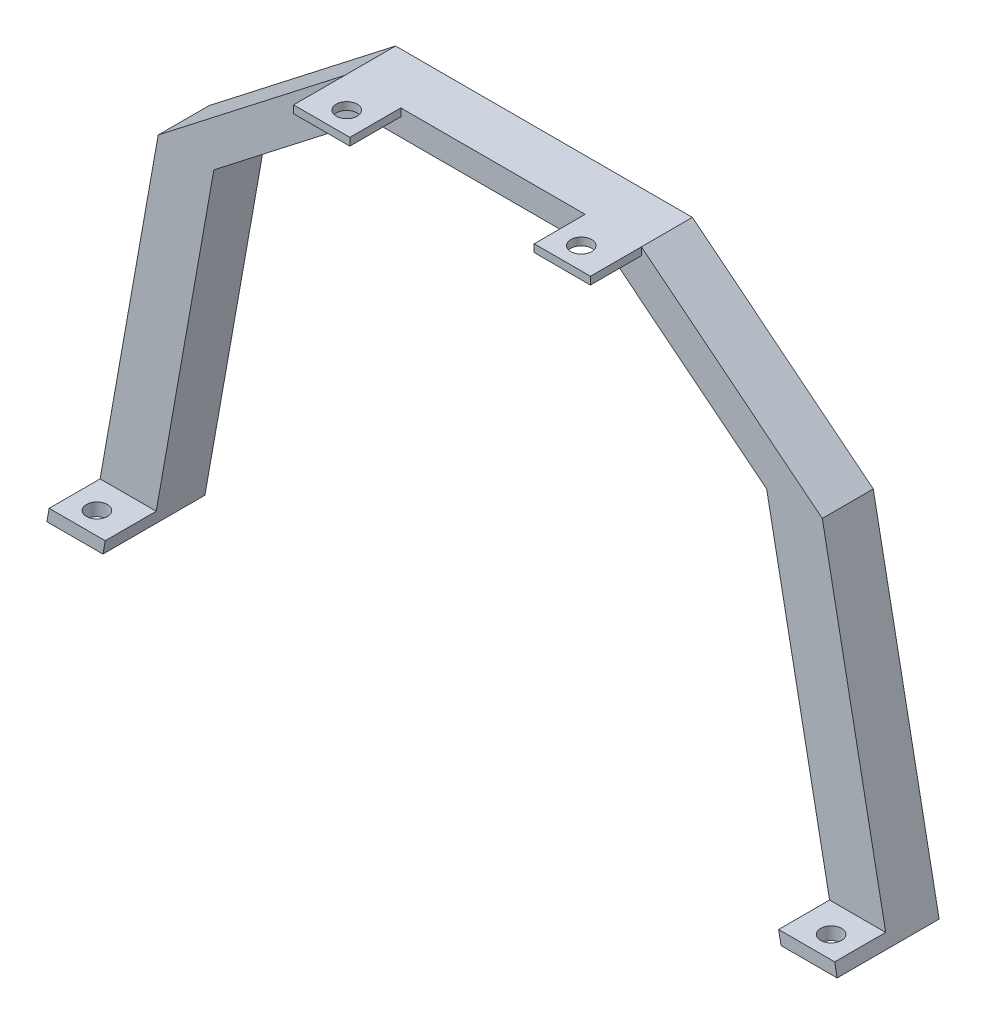
ISO-10303-21;
HEADER;
FILE_DESCRIPTION(('STEP AP214'),'2;1');
FILE_NAME('part.step','',(''),(''),'','','');
FILE_SCHEMA(('AUTOMOTIVE_DESIGN { 1 0 10303 214 1 1 1 1 }'));
ENDSEC;
DATA;
#1=APPLICATION_CONTEXT('core data for automotive mechanical design processes');
#2=APPLICATION_PROTOCOL_DEFINITION('international standard','automotive_design',2000,#1);
#3=PRODUCT_CONTEXT('',#1,'mechanical');
#4=PRODUCT('Part','Part','',(#3));
#5=PRODUCT_RELATED_PRODUCT_CATEGORY('part','',(#4));
#6=PRODUCT_DEFINITION_FORMATION('','',#4);
#7=PRODUCT_DEFINITION_CONTEXT('part definition',#1,'design');
#8=PRODUCT_DEFINITION('design','',#6,#7);
#9=PRODUCT_DEFINITION_SHAPE('','',#8);
#10=(LENGTH_UNIT() NAMED_UNIT(*) SI_UNIT(.MILLI.,.METRE.));
#11=(NAMED_UNIT(*) PLANE_ANGLE_UNIT() SI_UNIT($,.RADIAN.));
#12=(NAMED_UNIT(*) SI_UNIT($,.STERADIAN.) SOLID_ANGLE_UNIT());
#13=UNCERTAINTY_MEASURE_WITH_UNIT(LENGTH_MEASURE(1.E-05),#10,'distance_accuracy_value','');
#14=(GEOMETRIC_REPRESENTATION_CONTEXT(3) GLOBAL_UNCERTAINTY_ASSIGNED_CONTEXT((#13)) GLOBAL_UNIT_ASSIGNED_CONTEXT((#10,
#11,#12)) REPRESENTATION_CONTEXT('',''));
#15=CARTESIAN_POINT('',(0.,0.,0.));
#16=DIRECTION('',(0.,0.,1.));
#17=DIRECTION('',(1.,0.,0.));
#18=AXIS2_PLACEMENT_3D('',#15,#16,#17);
#19=CARTESIAN_POINT('',(37.3909379379324,95.,10.));
#20=DIRECTION('',(0.,-1.,0.));
#21=DIRECTION('',(1.,0.,0.));
#22=AXIS2_PLACEMENT_3D('',#19,#20,#21);
#23=PLANE('',#22);
#24=DIRECTION('',(-1.,0.,0.));
#25=VECTOR('',#24,1.);
#26=CARTESIAN_POINT('',(37.3909379379324,95.,0.));
#27=LINE('',#26,#25);
#28=CARTESIAN_POINT('',(95.6090620620676,95.,0.));
#29=VERTEX_POINT('',#28);
#30=CARTESIAN_POINT('',(37.3909379379324,95.,0.));
#31=VERTEX_POINT('',#30);
#32=EDGE_CURVE('E343',#29,#31,#27,.T.);
#33=ORIENTED_EDGE('',*,*,#32,.T.);
#34=DIRECTION('',(0.,0.,-1.));
#35=VECTOR('',#34,1.);
#36=CARTESIAN_POINT('',(37.3909379379324,95.,10.));
#37=LINE('',#36,#35);
#38=CARTESIAN_POINT('',(37.3909379379324,95.,10.));
#39=VERTEX_POINT('',#38);
#40=EDGE_CURVE('E358',#39,#31,#37,.T.);
#41=ORIENTED_EDGE('',*,*,#40,.F.);
#42=DIRECTION('',(0.,0.,-1.));
#43=VECTOR('',#42,1.);
#44=CARTESIAN_POINT('',(37.3909379379324,95.,20.));
#45=LINE('',#44,#43);
#46=CARTESIAN_POINT('',(37.3909379379324,95.,20.));
#47=VERTEX_POINT('',#46);
#48=EDGE_CURVE('E242',#47,#39,#45,.T.);
#49=ORIENTED_EDGE('',*,*,#48,.F.);
#50=DIRECTION('',(1.,0.,0.));
#51=VECTOR('',#50,1.);
#52=CARTESIAN_POINT('',(37.3909379379324,95.,20.));
#53=LINE('',#52,#51);
#54=CARTESIAN_POINT('',(48.4211280956552,95.,20.));
#55=VERTEX_POINT('',#54);
#56=EDGE_CURVE('E240',#47,#55,#53,.T.);
#57=ORIENTED_EDGE('',*,*,#56,.T.);
#58=DIRECTION('',(0.,0.,-1.));
#59=VECTOR('',#58,1.);
#60=CARTESIAN_POINT('',(48.4211280956552,95.,20.));
#61=LINE('',#60,#59);
#62=CARTESIAN_POINT('',(48.4211280956552,95.,10.));
#63=VERTEX_POINT('',#62);
#64=EDGE_CURVE('E197',#55,#63,#61,.T.);
#65=ORIENTED_EDGE('',*,*,#64,.T.);
#66=DIRECTION('',(-1.,0.,0.));
#67=VECTOR('',#66,1.);
#68=CARTESIAN_POINT('',(37.3909379379324,95.,10.));
#69=LINE('',#68,#67);
#70=CARTESIAN_POINT('',(84.5788719043448,95.,10.));
#71=VERTEX_POINT('',#70);
#72=EDGE_CURVE('E190',#71,#63,#69,.T.);
#73=ORIENTED_EDGE('',*,*,#72,.F.);
#74=DIRECTION('',(0.,0.,-1.));
#75=VECTOR('',#74,1.);
#76=CARTESIAN_POINT('',(84.5788719043448,95.,20.));
#77=LINE('',#76,#75);
#78=CARTESIAN_POINT('',(84.5788719043448,95.,20.));
#79=VERTEX_POINT('',#78);
#80=EDGE_CURVE('E194',#79,#71,#77,.T.);
#81=ORIENTED_EDGE('',*,*,#80,.F.);
#82=DIRECTION('',(-1.,0.,0.));
#83=VECTOR('',#82,1.);
#84=CARTESIAN_POINT('',(95.6090620620676,95.,20.));
#85=LINE('',#84,#83);
#86=CARTESIAN_POINT('',(95.6090620620676,95.,20.));
#87=VERTEX_POINT('',#86);
#88=EDGE_CURVE('E223',#87,#79,#85,.T.);
#89=ORIENTED_EDGE('',*,*,#88,.F.);
#90=DIRECTION('',(0.,0.,-1.));
#91=VECTOR('',#90,1.);
#92=CARTESIAN_POINT('',(95.6090620620676,95.,20.));
#93=LINE('',#92,#91);
#94=CARTESIAN_POINT('',(95.6090620620676,95.,10.));
#95=VERTEX_POINT('',#94);
#96=EDGE_CURVE('E212',#87,#95,#93,.T.);
#97=ORIENTED_EDGE('',*,*,#96,.T.);
#98=DIRECTION('',(0.,0.,-1.));
#99=VECTOR('',#98,1.);
#100=CARTESIAN_POINT('',(95.6090620620676,95.,10.));
#101=LINE('',#100,#99);
#102=EDGE_CURVE('E361',#95,#29,#101,.T.);
#103=ORIENTED_EDGE('',*,*,#102,.T.);
#104=EDGE_LOOP('',(#33,#41,#49,#57,#65,#73,#81,#89,#97,#103));
#105=FACE_BOUND('',#104,.T.);
#106=CARTESIAN_POINT('',(89.5,95.,15.6873727087576));
#107=DIRECTION('',(0.,1.,0.));
#108=DIRECTION('',(0.,0.,1.));
#109=AXIS2_PLACEMENT_3D('',#106,#107,#108);
#110=CIRCLE('',#109,2.04999999999999);
#111=CARTESIAN_POINT('',(89.5,95.,17.7373727087576));
#112=VERTEX_POINT('',#111);
#113=EDGE_CURVE('E387',#112,#112,#110,.F.);
#114=ORIENTED_EDGE('',*,*,#113,.T.);
#115=EDGE_LOOP('',(#114));
#116=FACE_BOUND('',#115,.T.);
#117=CARTESIAN_POINT('',(43.5,95.,15.6873727087576));
#118=DIRECTION('',(0.,1.,0.));
#119=DIRECTION('',(0.,0.,1.));
#120=AXIS2_PLACEMENT_3D('',#117,#118,#119);
#121=CIRCLE('',#120,2.05);
#122=CARTESIAN_POINT('',(43.5,95.,17.7373727087576));
#123=VERTEX_POINT('',#122);
#124=EDGE_CURVE('E382',#123,#123,#121,.T.);
#125=ORIENTED_EDGE('',*,*,#124,.F.);
#126=EDGE_LOOP('',(#125));
#127=FACE_BOUND('',#126,.T.);
#128=ADVANCED_FACE('F33',(#105,#116,#127),#23,.F.);
#129=CARTESIAN_POINT('',(0.,0.,10.));
#130=DIRECTION('',(0.,0.,-1.));
#131=DIRECTION('',(-1.,0.,0.));
#132=AXIS2_PLACEMENT_3D('',#129,#130,#131);
#133=PLANE('',#132);
#134=DIRECTION('',(-0.780710815786578,0.624892488444097,0.));
#135=VECTOR('',#134,1.);
#136=CARTESIAN_POINT('',(95.6090620620676,95.,10.));
#137=LINE('',#136,#135);
#138=CARTESIAN_POINT('',(131.084052408404,66.6052928346872,10.));
#139=VERTEX_POINT('',#138);
#140=EDGE_CURVE('E200',#139,#95,#137,.T.);
#141=ORIENTED_EDGE('',*,*,#140,.T.);
#142=DIRECTION('',(0.,-1.,0.));
#143=VECTOR('',#142,1.);
#144=CARTESIAN_POINT('',(95.6090620620676,95.,10.));
#145=LINE('',#144,#143);
#146=CARTESIAN_POINT('',(95.6090620620676,93.5,10.));
#147=VERTEX_POINT('',#146);
#148=EDGE_CURVE('E55',#95,#147,#145,.T.);
#149=ORIENTED_EDGE('',*,*,#148,.T.);
#150=DIRECTION('',(-1.,0.,0.));
#151=VECTOR('',#150,1.);
#152=CARTESIAN_POINT('',(95.6090620620676,93.5,10.));
#153=LINE('',#152,#151);
#154=CARTESIAN_POINT('',(84.5788719043448,93.5,10.));
#155=VERTEX_POINT('',#154);
#156=EDGE_CURVE('E50',#147,#155,#153,.T.);
#157=ORIENTED_EDGE('',*,*,#156,.T.);
#158=DIRECTION('',(0.,-1.,0.));
#159=VECTOR('',#158,1.);
#160=CARTESIAN_POINT('',(84.5788719043448,95.,10.));
#161=LINE('',#160,#159);
#162=EDGE_CURVE('E203',#71,#155,#161,.T.);
#163=ORIENTED_EDGE('',*,*,#162,.F.);
#164=ORIENTED_EDGE('',*,*,#72,.T.);
#165=DIRECTION('',(0.,-1.,0.));
#166=VECTOR('',#165,1.);
#167=CARTESIAN_POINT('',(48.4211280956552,95.,10.));
#168=LINE('',#167,#166);
#169=CARTESIAN_POINT('',(48.4211280956552,93.5,10.));
#170=VERTEX_POINT('',#169);
#171=EDGE_CURVE('E235',#63,#170,#168,.T.);
#172=ORIENTED_EDGE('',*,*,#171,.T.);
#173=DIRECTION('',(1.,0.,0.));
#174=VECTOR('',#173,1.);
#175=CARTESIAN_POINT('',(37.3909379379324,93.5,10.));
#176=LINE('',#175,#174);
#177=CARTESIAN_POINT('',(37.3909379379324,93.5,10.));
#178=VERTEX_POINT('',#177);
#179=EDGE_CURVE('E245',#178,#170,#176,.T.);
#180=ORIENTED_EDGE('',*,*,#179,.F.);
#181=DIRECTION('',(0.,-1.,0.));
#182=VECTOR('',#181,1.);
#183=CARTESIAN_POINT('',(37.3909379379324,95.,10.));
#184=LINE('',#183,#182);
#185=EDGE_CURVE('E222',#39,#178,#184,.T.);
#186=ORIENTED_EDGE('',*,*,#185,.F.);
#187=DIRECTION('',(-0.789791008388379,-0.613376037247028,0.));
#188=VECTOR('',#187,1.);
#189=CARTESIAN_POINT('',(0.829541595098959,66.6052928346872,10.));
#190=LINE('',#189,#188);
#191=CARTESIAN_POINT('',(0.829541595098959,66.6052928346872,10.));
#192=VERTEX_POINT('',#191);
#193=EDGE_CURVE('E199',#39,#192,#190,.T.);
#194=ORIENTED_EDGE('',*,*,#193,.T.);
#195=DIRECTION('',(-0.174869984182596,-0.984591533902247,0.));
#196=VECTOR('',#195,1.);
#197=CARTESIAN_POINT('',(-11.,0.,10.));
#198=LINE('',#197,#196);
#199=CARTESIAN_POINT('',(-10.5559834252039,2.5,10.));
#200=VERTEX_POINT('',#199);
#201=EDGE_CURVE('E324',#192,#200,#198,.T.);
#202=ORIENTED_EDGE('',*,*,#201,.T.);
#203=DIRECTION('',(-1.,0.,0.));
#204=VECTOR('',#203,1.);
#205=CARTESIAN_POINT('',(0.444016574796075,2.5,10.));
#206=LINE('',#205,#204);
#207=CARTESIAN_POINT('',(0.444016574796076,2.5,10.));
#208=VERTEX_POINT('',#207);
#209=EDGE_CURVE('E289',#208,#200,#206,.T.);
#210=ORIENTED_EDGE('',*,*,#209,.F.);
#211=DIRECTION('',(0.174869984182596,0.984591533902247,0.));
#212=VECTOR('',#211,1.);
#213=CARTESIAN_POINT('',(0.,0.,10.));
#214=LINE('',#213,#212);
#215=CARTESIAN_POINT('',(11.7453685319245,66.131363098995,10.));
#216=VERTEX_POINT('',#215);
#217=EDGE_CURVE('E309',#208,#216,#214,.T.);
#218=ORIENTED_EDGE('',*,*,#217,.T.);
#219=DIRECTION('',(0.789791008388379,0.613376037247028,0.));
#220=VECTOR('',#219,1.);
#221=CARTESIAN_POINT('',(11.7453685319245,66.131363098995,10.));
#222=LINE('',#221,#220);
#223=CARTESIAN_POINT('',(42.4789376023914,90.,10.));
#224=VERTEX_POINT('',#223);
#225=EDGE_CURVE('E311',#216,#224,#222,.T.);
#226=ORIENTED_EDGE('',*,*,#225,.T.);
#227=DIRECTION('',(1.,0.,0.));
#228=VECTOR('',#227,1.);
#229=CARTESIAN_POINT('',(42.4789376023914,90.,10.));
#230=LINE('',#229,#228);
#231=CARTESIAN_POINT('',(90.3556213621701,90.,10.));
#232=VERTEX_POINT('',#231);
#233=EDGE_CURVE('E314',#224,#232,#230,.T.);
#234=ORIENTED_EDGE('',*,*,#233,.T.);
#235=DIRECTION('',(0.780710815786578,-0.624892488444098,0.));
#236=VECTOR('',#235,1.);
#237=CARTESIAN_POINT('',(90.3556213621701,90.,10.));
#238=LINE('',#237,#236);
#239=CARTESIAN_POINT('',(120.175955789769,66.1313630989951,10.));
#240=VERTEX_POINT('',#239);
#241=EDGE_CURVE('E316',#232,#240,#238,.T.);
#242=ORIENTED_EDGE('',*,*,#241,.T.);
#243=DIRECTION('',(0.190371396148273,-0.981712142905728,0.));
#244=VECTOR('',#243,1.);
#245=CARTESIAN_POINT('',(120.175955789769,66.1313630989951,10.));
#246=LINE('',#245,#244);
#247=CARTESIAN_POINT('',(132.51520566002,2.50000000000002,10.));
#248=VERTEX_POINT('',#247);
#249=EDGE_CURVE('E318',#240,#248,#246,.T.);
#250=ORIENTED_EDGE('',*,*,#249,.T.);
#251=DIRECTION('',(-1.,0.,0.));
#252=VECTOR('',#251,1.);
#253=CARTESIAN_POINT('',(143.51520566002,2.5,10.));
#254=LINE('',#253,#252);
#255=CARTESIAN_POINT('',(143.51520566002,2.5,10.));
#256=VERTEX_POINT('',#255);
#257=EDGE_CURVE('E270',#256,#248,#254,.T.);
#258=ORIENTED_EDGE('',*,*,#257,.F.);
#259=DIRECTION('',(-0.190371396148273,0.981712142905728,0.));
#260=VECTOR('',#259,1.);
#261=CARTESIAN_POINT('',(131.084052408404,66.6052928346872,10.));
#262=LINE('',#261,#260);
#263=EDGE_CURVE('E320',#256,#139,#262,.T.);
#264=ORIENTED_EDGE('',*,*,#263,.T.);
#265=EDGE_LOOP('',(#141,#149,#157,#163,#164,#172,#180,#186,#194,#202,#210,#218,#226,#234,#242,
#250,#258,#264));
#266=FACE_BOUND('',#265,.T.);
#267=ADVANCED_FACE('F204',(#266),#133,.F.);
#268=CARTESIAN_POINT('',(0.,0.,10.));
#269=DIRECTION('',(-0.984591533902247,0.174869984182596,0.));
#270=DIRECTION('',(-0.174869984182596,-0.984591533902247,0.));
#271=AXIS2_PLACEMENT_3D('',#268,#269,#270);
#272=PLANE('',#271);
#273=DIRECTION('',(0.174869984182596,0.984591533902247,0.));
#274=VECTOR('',#273,1.);
#275=CARTESIAN_POINT('',(0.,0.,0.));
#276=LINE('',#275,#274);
#277=CARTESIAN_POINT('',(0.,0.,0.));
#278=VERTEX_POINT('',#277);
#279=CARTESIAN_POINT('',(11.7453685319245,66.131363098995,0.));
#280=VERTEX_POINT('',#279);
#281=EDGE_CURVE('E308',#278,#280,#276,.T.);
#282=ORIENTED_EDGE('',*,*,#281,.T.);
#283=DIRECTION('',(0.,0.,-1.));
#284=VECTOR('',#283,1.);
#285=CARTESIAN_POINT('',(11.7453685319245,66.131363098995,10.));
#286=LINE('',#285,#284);
#287=EDGE_CURVE('E11',#216,#280,#286,.T.);
#288=ORIENTED_EDGE('',*,*,#287,.F.);
#289=ORIENTED_EDGE('',*,*,#217,.F.);
#290=DIRECTION('',(0.,0.,-1.));
#291=VECTOR('',#290,1.);
#292=CARTESIAN_POINT('',(0.444016574796075,2.5,20.));
#293=LINE('',#292,#291);
#294=CARTESIAN_POINT('',(0.444016574796075,2.5,20.));
#295=VERTEX_POINT('',#294);
#296=EDGE_CURVE('E305',#295,#208,#293,.T.);
#297=ORIENTED_EDGE('',*,*,#296,.F.);
#298=DIRECTION('',(0.174869984182596,0.984591533902247,0.));
#299=VECTOR('',#298,1.);
#300=CARTESIAN_POINT('',(0.,0.,20.));
#301=LINE('',#300,#299);
#302=CARTESIAN_POINT('',(0.,0.,20.));
#303=VERTEX_POINT('',#302);
#304=EDGE_CURVE('E296',#303,#295,#301,.T.);
#305=ORIENTED_EDGE('',*,*,#304,.F.);
#306=DIRECTION('',(0.,0.,-1.));
#307=VECTOR('',#306,1.);
#308=CARTESIAN_POINT('',(0.,0.,10.));
#309=LINE('',#308,#307);
#310=EDGE_CURVE('E326',#303,#278,#309,.T.);
#311=ORIENTED_EDGE('',*,*,#310,.T.);
#312=EDGE_LOOP('',(#282,#288,#289,#297,#305,#311));
#313=FACE_BOUND('',#312,.T.);
#314=ADVANCED_FACE('F35',(#313),#272,.F.);
#315=CARTESIAN_POINT('',(11.7453685319245,66.131363098995,10.));
#316=DIRECTION('',(-0.613376037247028,0.789791008388379,0.));
#317=DIRECTION('',(-0.789791008388379,-0.613376037247028,0.));
#318=AXIS2_PLACEMENT_3D('',#315,#316,#317);
#319=PLANE('',#318);
#320=DIRECTION('',(0.789791008388379,0.613376037247028,0.));
#321=VECTOR('',#320,1.);
#322=CARTESIAN_POINT('',(11.7453685319245,66.131363098995,0.));
#323=LINE('',#322,#321);
#324=CARTESIAN_POINT('',(42.4789376023914,90.,0.));
#325=VERTEX_POINT('',#324);
#326=EDGE_CURVE('E329',#280,#325,#323,.T.);
#327=ORIENTED_EDGE('',*,*,#326,.T.);
#328=DIRECTION('',(0.,0.,-1.));
#329=VECTOR('',#328,1.);
#330=CARTESIAN_POINT('',(42.4789376023914,90.,10.));
#331=LINE('',#330,#329);
#332=EDGE_CURVE('E42',#224,#325,#331,.T.);
#333=ORIENTED_EDGE('',*,*,#332,.F.);
#334=ORIENTED_EDGE('',*,*,#225,.F.);
#335=ORIENTED_EDGE('',*,*,#287,.T.);
#336=EDGE_LOOP('',(#327,#333,#334,#335));
#337=FACE_BOUND('',#336,.T.);
#338=ADVANCED_FACE('F434',(#337),#319,.F.);
#339=CARTESIAN_POINT('',(42.4789376023914,90.,10.));
#340=DIRECTION('',(0.,1.,0.));
#341=DIRECTION('',(-1.,0.,0.));
#342=AXIS2_PLACEMENT_3D('',#339,#340,#341);
#343=PLANE('',#342);
#344=DIRECTION('',(1.,0.,0.));
#345=VECTOR('',#344,1.);
#346=CARTESIAN_POINT('',(42.4789376023914,90.,0.));
#347=LINE('',#346,#345);
#348=CARTESIAN_POINT('',(90.3556213621701,90.,0.));
#349=VERTEX_POINT('',#348);
#350=EDGE_CURVE('E331',#325,#349,#347,.T.);
#351=ORIENTED_EDGE('',*,*,#350,.T.);
#352=DIRECTION('',(0.,0.,-1.));
#353=VECTOR('',#352,1.);
#354=CARTESIAN_POINT('',(90.3556213621701,90.,10.));
#355=LINE('',#354,#353);
#356=EDGE_CURVE('E376',#232,#349,#355,.T.);
#357=ORIENTED_EDGE('',*,*,#356,.F.);
#358=ORIENTED_EDGE('',*,*,#233,.F.);
#359=ORIENTED_EDGE('',*,*,#332,.T.);
#360=EDGE_LOOP('',(#351,#357,#358,#359));
#361=FACE_BOUND('',#360,.T.);
#362=ADVANCED_FACE('F439',(#361),#343,.F.);
#363=CARTESIAN_POINT('',(90.3556213621701,90.,10.));
#364=DIRECTION('',(0.624892488444098,0.780710815786578,0.));
#365=DIRECTION('',(-0.780710815786578,0.624892488444098,0.));
#366=AXIS2_PLACEMENT_3D('',#363,#364,#365);
#367=PLANE('',#366);
#368=DIRECTION('',(0.780710815786578,-0.624892488444098,0.));
#369=VECTOR('',#368,1.);
#370=CARTESIAN_POINT('',(90.3556213621701,90.,0.));
#371=LINE('',#370,#369);
#372=CARTESIAN_POINT('',(120.175955789769,66.1313630989951,0.));
#373=VERTEX_POINT('',#372);
#374=EDGE_CURVE('E333',#349,#373,#371,.T.);
#375=ORIENTED_EDGE('',*,*,#374,.T.);
#376=DIRECTION('',(0.,0.,-1.));
#377=VECTOR('',#376,1.);
#378=CARTESIAN_POINT('',(120.175955789769,66.1313630989951,10.));
#379=LINE('',#378,#377);
#380=EDGE_CURVE('E373',#240,#373,#379,.T.);
#381=ORIENTED_EDGE('',*,*,#380,.F.);
#382=ORIENTED_EDGE('',*,*,#241,.F.);
#383=ORIENTED_EDGE('',*,*,#356,.T.);
#384=EDGE_LOOP('',(#375,#381,#382,#383));
#385=FACE_BOUND('',#384,.T.);
#386=ADVANCED_FACE('F445',(#385),#367,.F.);
#387=CARTESIAN_POINT('',(120.175955789769,66.1313630989951,10.));
#388=DIRECTION('',(0.981712142905728,0.190371396148273,0.));
#389=DIRECTION('',(-0.190371396148273,0.981712142905728,0.));
#390=AXIS2_PLACEMENT_3D('',#387,#388,#389);
#391=PLANE('',#390);
#392=DIRECTION('',(0.190371396148273,-0.981712142905728,0.));
#393=VECTOR('',#392,1.);
#394=CARTESIAN_POINT('',(120.175955789769,66.1313630989951,0.));
#395=LINE('',#394,#393);
#396=CARTESIAN_POINT('',(133.,0.,0.));
#397=VERTEX_POINT('',#396);
#398=EDGE_CURVE('E335',#373,#397,#395,.T.);
#399=ORIENTED_EDGE('',*,*,#398,.T.);
#400=DIRECTION('',(0.,0.,-1.));
#401=VECTOR('',#400,1.);
#402=CARTESIAN_POINT('',(133.,0.,10.));
#403=LINE('',#402,#401);
#404=CARTESIAN_POINT('',(133.,0.,20.));
#405=VERTEX_POINT('',#404);
#406=EDGE_CURVE('E370',#405,#397,#403,.T.);
#407=ORIENTED_EDGE('',*,*,#406,.F.);
#408=DIRECTION('',(0.190371396148276,-0.981712142905728,0.));
#409=VECTOR('',#408,1.);
#410=CARTESIAN_POINT('',(132.51520566002,2.5,20.));
#411=LINE('',#410,#409);
#412=CARTESIAN_POINT('',(132.51520566002,2.5,20.));
#413=VERTEX_POINT('',#412);
#414=EDGE_CURVE('E271',#413,#405,#411,.T.);
#415=ORIENTED_EDGE('',*,*,#414,.F.);
#416=DIRECTION('',(0.,0.,-1.));
#417=VECTOR('',#416,1.);
#418=CARTESIAN_POINT('',(132.51520566002,2.5,20.));
#419=LINE('',#418,#417);
#420=EDGE_CURVE('E281',#413,#248,#419,.T.);
#421=ORIENTED_EDGE('',*,*,#420,.T.);
#422=ORIENTED_EDGE('',*,*,#249,.F.);
#423=ORIENTED_EDGE('',*,*,#380,.T.);
#424=EDGE_LOOP('',(#399,#407,#415,#421,#422,#423));
#425=FACE_BOUND('',#424,.T.);
#426=ADVANCED_FACE('F449',(#425),#391,.F.);
#427=CARTESIAN_POINT('',(133.,0.,10.));
#428=DIRECTION('',(0.,1.,0.));
#429=DIRECTION('',(0.,0.,1.));
#430=AXIS2_PLACEMENT_3D('',#427,#428,#429);
#431=PLANE('',#430);
#432=CARTESIAN_POINT('',(138.5,0.,15.6873727087576));
#433=DIRECTION('',(0.,1.,0.));
#434=DIRECTION('',(0.,0.,1.));
#435=AXIS2_PLACEMENT_3D('',#432,#433,#434);
#436=CIRCLE('',#435,2.04999999999999);
#437=CARTESIAN_POINT('',(138.5,0.,17.7373727087576));
#438=VERTEX_POINT('',#437);
#439=EDGE_CURVE('E262',#438,#438,#436,.T.);
#440=ORIENTED_EDGE('',*,*,#439,.T.);
#441=EDGE_LOOP('',(#440));
#442=FACE_BOUND('',#441,.T.);
#443=DIRECTION('',(1.,0.,0.));
#444=VECTOR('',#443,1.);
#445=CARTESIAN_POINT('',(133.,0.,0.));
#446=LINE('',#445,#444);
#447=CARTESIAN_POINT('',(144.,0.,0.));
#448=VERTEX_POINT('',#447);
#449=EDGE_CURVE('E337',#397,#448,#446,.T.);
#450=ORIENTED_EDGE('',*,*,#449,.T.);
#451=DIRECTION('',(0.,0.,-1.));
#452=VECTOR('',#451,1.);
#453=CARTESIAN_POINT('',(144.,0.,10.));
#454=LINE('',#453,#452);
#455=CARTESIAN_POINT('',(144.,0.,20.));
#456=VERTEX_POINT('',#455);
#457=EDGE_CURVE('E367',#456,#448,#454,.T.);
#458=ORIENTED_EDGE('',*,*,#457,.F.);
#459=DIRECTION('',(1.,0.,0.));
#460=VECTOR('',#459,1.);
#461=CARTESIAN_POINT('',(133.,0.,20.));
#462=LINE('',#461,#460);
#463=EDGE_CURVE('E274',#405,#456,#462,.T.);
#464=ORIENTED_EDGE('',*,*,#463,.F.);
#465=ORIENTED_EDGE('',*,*,#406,.T.);
#466=EDGE_LOOP('',(#450,#458,#464,#465));
#467=FACE_BOUND('',#466,.T.);
#468=ADVANCED_FACE('F467',(#442,#467),#431,.F.);
#469=CARTESIAN_POINT('',(131.084052408404,66.6052928346872,10.));
#470=DIRECTION('',(-0.981712142905728,-0.190371396148273,0.));
#471=DIRECTION('',(0.190371396148273,-0.981712142905728,0.));
#472=AXIS2_PLACEMENT_3D('',#469,#470,#471);
#473=PLANE('',#472);
#474=DIRECTION('',(-0.190371396148273,0.981712142905728,0.));
#475=VECTOR('',#474,1.);
#476=CARTESIAN_POINT('',(131.084052408404,66.6052928346872,0.));
#477=LINE('',#476,#475);
#478=CARTESIAN_POINT('',(131.084052408404,66.6052928346872,0.));
#479=VERTEX_POINT('',#478);
#480=EDGE_CURVE('E339',#448,#479,#477,.T.);
#481=ORIENTED_EDGE('',*,*,#480,.T.);
#482=DIRECTION('',(0.,0.,-1.));
#483=VECTOR('',#482,1.);
#484=CARTESIAN_POINT('',(131.084052408404,66.6052928346872,10.));
#485=LINE('',#484,#483);
#486=EDGE_CURVE('E364',#139,#479,#485,.T.);
#487=ORIENTED_EDGE('',*,*,#486,.F.);
#488=ORIENTED_EDGE('',*,*,#263,.F.);
#489=DIRECTION('',(0.,0.,-1.));
#490=VECTOR('',#489,1.);
#491=CARTESIAN_POINT('',(143.51520566002,2.5,20.));
#492=LINE('',#491,#490);
#493=CARTESIAN_POINT('',(143.51520566002,2.5,20.));
#494=VERTEX_POINT('',#493);
#495=EDGE_CURVE('E286',#494,#256,#492,.T.);
#496=ORIENTED_EDGE('',*,*,#495,.F.);
#497=DIRECTION('',(-0.190371396148276,0.981712142905728,0.));
#498=VECTOR('',#497,1.);
#499=CARTESIAN_POINT('',(144.,0.,20.));
#500=LINE('',#499,#498);
#501=EDGE_CURVE('E277',#456,#494,#500,.T.);
#502=ORIENTED_EDGE('',*,*,#501,.F.);
#503=ORIENTED_EDGE('',*,*,#457,.T.);
#504=EDGE_LOOP('',(#481,#487,#488,#496,#502,#503));
#505=FACE_BOUND('',#504,.T.);
#506=ADVANCED_FACE('F458',(#505),#473,.F.);
#507=CARTESIAN_POINT('',(95.6090620620676,95.,10.));
#508=DIRECTION('',(-0.624892488444097,-0.780710815786578,0.));
#509=DIRECTION('',(0.780710815786578,-0.624892488444097,0.));
#510=AXIS2_PLACEMENT_3D('',#507,#508,#509);
#511=PLANE('',#510);
#512=DIRECTION('',(-0.780710815786578,0.624892488444097,0.));
#513=VECTOR('',#512,1.);
#514=CARTESIAN_POINT('',(95.6090620620676,95.,0.));
#515=LINE('',#514,#513);
#516=EDGE_CURVE('E341',#479,#29,#515,.T.);
#517=ORIENTED_EDGE('',*,*,#516,.T.);
#518=ORIENTED_EDGE('',*,*,#102,.F.);
#519=ORIENTED_EDGE('',*,*,#140,.F.);
#520=ORIENTED_EDGE('',*,*,#486,.T.);
#521=EDGE_LOOP('',(#517,#518,#519,#520));
#522=FACE_BOUND('',#521,.T.);
#523=ADVANCED_FACE('F459',(#522),#511,.F.);
#524=CARTESIAN_POINT('',(0.829541595098959,66.6052928346872,10.));
#525=DIRECTION('',(0.613376037247028,-0.789791008388379,0.));
#526=DIRECTION('',(0.789791008388379,0.613376037247028,0.));
#527=AXIS2_PLACEMENT_3D('',#524,#525,#526);
#528=PLANE('',#527);
#529=DIRECTION('',(-0.789791008388379,-0.613376037247028,0.));
#530=VECTOR('',#529,1.);
#531=CARTESIAN_POINT('',(0.829541595098959,66.6052928346872,0.));
#532=LINE('',#531,#530);
#533=CARTESIAN_POINT('',(0.829541595098959,66.6052928346872,0.));
#534=VERTEX_POINT('',#533);
#535=EDGE_CURVE('E345',#31,#534,#532,.T.);
#536=ORIENTED_EDGE('',*,*,#535,.T.);
#537=DIRECTION('',(0.,0.,-1.));
#538=VECTOR('',#537,1.);
#539=CARTESIAN_POINT('',(0.829541595098959,66.6052928346872,10.));
#540=LINE('',#539,#538);
#541=EDGE_CURVE('E355',#192,#534,#540,.T.);
#542=ORIENTED_EDGE('',*,*,#541,.F.);
#543=ORIENTED_EDGE('',*,*,#193,.F.);
#544=ORIENTED_EDGE('',*,*,#40,.T.);
#545=EDGE_LOOP('',(#536,#542,#543,#544));
#546=FACE_BOUND('',#545,.T.);
#547=ADVANCED_FACE('F416',(#546),#528,.F.);
#548=CARTESIAN_POINT('',(-11.,0.,10.));
#549=DIRECTION('',(0.984591533902246,-0.174869984182596,0.));
#550=DIRECTION('',(0.174869984182596,0.984591533902247,0.));
#551=AXIS2_PLACEMENT_3D('',#548,#549,#550);
#552=PLANE('',#551);
#553=DIRECTION('',(-0.174869984182596,-0.984591533902247,0.));
#554=VECTOR('',#553,1.);
#555=CARTESIAN_POINT('',(-11.,0.,0.));
#556=LINE('',#555,#554);
#557=CARTESIAN_POINT('',(-11.,0.,0.));
#558=VERTEX_POINT('',#557);
#559=EDGE_CURVE('E347',#534,#558,#556,.T.);
#560=ORIENTED_EDGE('',*,*,#559,.T.);
#561=DIRECTION('',(0.,0.,-1.));
#562=VECTOR('',#561,1.);
#563=CARTESIAN_POINT('',(-11.,0.,10.));
#564=LINE('',#563,#562);
#565=CARTESIAN_POINT('',(-11.,0.,20.));
#566=VERTEX_POINT('',#565);
#567=EDGE_CURVE('E352',#566,#558,#564,.T.);
#568=ORIENTED_EDGE('',*,*,#567,.F.);
#569=DIRECTION('',(-0.174869984182596,-0.984591533902247,0.));
#570=VECTOR('',#569,1.);
#571=CARTESIAN_POINT('',(-10.5559834252039,2.5,20.));
#572=LINE('',#571,#570);
#573=CARTESIAN_POINT('',(-10.5559834252039,2.5,20.));
#574=VERTEX_POINT('',#573);
#575=EDGE_CURVE('E290',#574,#566,#572,.T.);
#576=ORIENTED_EDGE('',*,*,#575,.F.);
#577=DIRECTION('',(0.,0.,-1.));
#578=VECTOR('',#577,1.);
#579=CARTESIAN_POINT('',(-10.5559834252039,2.5,20.));
#580=LINE('',#579,#578);
#581=EDGE_CURVE('E300',#574,#200,#580,.T.);
#582=ORIENTED_EDGE('',*,*,#581,.T.);
#583=ORIENTED_EDGE('',*,*,#201,.F.);
#584=ORIENTED_EDGE('',*,*,#541,.T.);
#585=EDGE_LOOP('',(#560,#568,#576,#582,#583,#584));
#586=FACE_BOUND('',#585,.T.);
#587=ADVANCED_FACE('F419',(#586),#552,.F.);
#588=CARTESIAN_POINT('',(0.,0.,10.));
#589=DIRECTION('',(0.,1.,0.));
#590=DIRECTION('',(-1.,0.,0.));
#591=AXIS2_PLACEMENT_3D('',#588,#589,#590);
#592=PLANE('',#591);
#593=CARTESIAN_POINT('',(-5.5,0.,15.6873727087576));
#594=DIRECTION('',(0.,1.,0.));
#595=DIRECTION('',(-1.,0.,0.));
#596=AXIS2_PLACEMENT_3D('',#593,#594,#595);
#597=CIRCLE('',#596,2.05);
#598=CARTESIAN_POINT('',(-7.55,0.,15.6873727087576));
#599=VERTEX_POINT('',#598);
#600=EDGE_CURVE('E267',#599,#599,#597,.T.);
#601=ORIENTED_EDGE('',*,*,#600,.T.);
#602=EDGE_LOOP('',(#601));
#603=FACE_BOUND('',#602,.T.);
#604=DIRECTION('',(1.,0.,0.));
#605=VECTOR('',#604,1.);
#606=CARTESIAN_POINT('',(0.,0.,0.));
#607=LINE('',#606,#605);
#608=EDGE_CURVE('E312',#558,#278,#607,.T.);
#609=ORIENTED_EDGE('',*,*,#608,.T.);
#610=ORIENTED_EDGE('',*,*,#310,.F.);
#611=DIRECTION('',(1.,0.,0.));
#612=VECTOR('',#611,1.);
#613=CARTESIAN_POINT('',(-11.,0.,20.));
#614=LINE('',#613,#612);
#615=EDGE_CURVE('E293',#566,#303,#614,.T.);
#616=ORIENTED_EDGE('',*,*,#615,.F.);
#617=ORIENTED_EDGE('',*,*,#567,.T.);
#618=EDGE_LOOP('',(#609,#610,#616,#617));
#619=FACE_BOUND('',#618,.T.);
#620=ADVANCED_FACE('F478',(#603,#619),#592,.F.);
#621=CARTESIAN_POINT('',(0.,0.,0.));
#622=DIRECTION('',(0.,0.,-1.));
#623=DIRECTION('',(-1.,0.,0.));
#624=AXIS2_PLACEMENT_3D('',#621,#622,#623);
#625=PLANE('',#624);
#626=ORIENTED_EDGE('',*,*,#281,.F.);
#627=ORIENTED_EDGE('',*,*,#608,.F.);
#628=ORIENTED_EDGE('',*,*,#559,.F.);
#629=ORIENTED_EDGE('',*,*,#535,.F.);
#630=ORIENTED_EDGE('',*,*,#32,.F.);
#631=ORIENTED_EDGE('',*,*,#516,.F.);
#632=ORIENTED_EDGE('',*,*,#480,.F.);
#633=ORIENTED_EDGE('',*,*,#449,.F.);
#634=ORIENTED_EDGE('',*,*,#398,.F.);
#635=ORIENTED_EDGE('',*,*,#374,.F.);
#636=ORIENTED_EDGE('',*,*,#350,.F.);
#637=ORIENTED_EDGE('',*,*,#326,.F.);
#638=EDGE_LOOP('',(#626,#627,#628,#629,#630,#631,#632,#633,#634,#635,#636,#637));
#639=FACE_BOUND('',#638,.T.);
#640=ADVANCED_FACE('F410',(#639),#625,.T.);
#641=CARTESIAN_POINT('',(0.444016574796075,2.5,20.));
#642=DIRECTION('',(0.,-1.,0.));
#643=DIRECTION('',(1.,0.,0.));
#644=AXIS2_PLACEMENT_3D('',#641,#642,#643);
#645=PLANE('',#644);
#646=CARTESIAN_POINT('',(-5.5,2.5,15.6873727087576));
#647=DIRECTION('',(0.,1.,0.));
#648=DIRECTION('',(-1.,0.,0.));
#649=AXIS2_PLACEMENT_3D('',#646,#647,#648);
#650=CIRCLE('',#649,2.05);
#651=CARTESIAN_POINT('',(-7.55,2.5,15.6873727087576));
#652=VERTEX_POINT('',#651);
#653=EDGE_CURVE('E259',#652,#652,#650,.T.);
#654=ORIENTED_EDGE('',*,*,#653,.F.);
#655=EDGE_LOOP('',(#654));
#656=FACE_BOUND('',#655,.T.);
#657=ORIENTED_EDGE('',*,*,#209,.T.);
#658=ORIENTED_EDGE('',*,*,#581,.F.);
#659=DIRECTION('',(-1.,0.,0.));
#660=VECTOR('',#659,1.);
#661=CARTESIAN_POINT('',(0.444016574796075,2.5,20.));
#662=LINE('',#661,#660);
#663=EDGE_CURVE('E298',#295,#574,#662,.T.);
#664=ORIENTED_EDGE('',*,*,#663,.F.);
#665=ORIENTED_EDGE('',*,*,#296,.T.);
#666=EDGE_LOOP('',(#657,#658,#664,#665));
#667=FACE_BOUND('',#666,.T.);
#668=ADVANCED_FACE('F425',(#656,#667),#645,.F.);
#669=CARTESIAN_POINT('',(0.,0.,20.));
#670=DIRECTION('',(0.,0.,1.));
#671=DIRECTION('',(1.,0.,0.));
#672=AXIS2_PLACEMENT_3D('',#669,#670,#671);
#673=PLANE('',#672);
#674=ORIENTED_EDGE('',*,*,#575,.T.);
#675=ORIENTED_EDGE('',*,*,#615,.T.);
#676=ORIENTED_EDGE('',*,*,#304,.T.);
#677=ORIENTED_EDGE('',*,*,#663,.T.);
#678=EDGE_LOOP('',(#674,#675,#676,#677));
#679=FACE_BOUND('',#678,.T.);
#680=ADVANCED_FACE('F486',(#679),#673,.T.);
#681=CARTESIAN_POINT('',(143.51520566002,2.5,20.));
#682=DIRECTION('',(0.,-1.,0.));
#683=DIRECTION('',(1.,0.,0.));
#684=AXIS2_PLACEMENT_3D('',#681,#682,#683);
#685=PLANE('',#684);
#686=CARTESIAN_POINT('',(138.5,2.50000000000003,15.6873727087576));
#687=DIRECTION('',(0.,1.,0.));
#688=DIRECTION('',(-1.,0.,0.));
#689=AXIS2_PLACEMENT_3D('',#686,#687,#688);
#690=CIRCLE('',#689,2.04999999999999);
#691=CARTESIAN_POINT('',(136.45,2.50000000000003,15.6873727087576));
#692=VERTEX_POINT('',#691);
#693=EDGE_CURVE('E258',#692,#692,#690,.T.);
#694=ORIENTED_EDGE('',*,*,#693,.F.);
#695=EDGE_LOOP('',(#694));
#696=FACE_BOUND('',#695,.T.);
#697=ORIENTED_EDGE('',*,*,#257,.T.);
#698=ORIENTED_EDGE('',*,*,#420,.F.);
#699=DIRECTION('',(-1.,0.,0.));
#700=VECTOR('',#699,1.);
#701=CARTESIAN_POINT('',(143.51520566002,2.5,20.));
#702=LINE('',#701,#700);
#703=EDGE_CURVE('E279',#494,#413,#702,.T.);
#704=ORIENTED_EDGE('',*,*,#703,.F.);
#705=ORIENTED_EDGE('',*,*,#495,.T.);
#706=EDGE_LOOP('',(#697,#698,#704,#705));
#707=FACE_BOUND('',#706,.T.);
#708=ADVANCED_FACE('F454',(#696,#707),#685,.F.);
#709=CARTESIAN_POINT('',(0.,0.,20.));
#710=DIRECTION('',(0.,0.,1.));
#711=DIRECTION('',(1.,0.,0.));
#712=AXIS2_PLACEMENT_3D('',#709,#710,#711);
#713=PLANE('',#712);
#714=ORIENTED_EDGE('',*,*,#414,.T.);
#715=ORIENTED_EDGE('',*,*,#463,.T.);
#716=ORIENTED_EDGE('',*,*,#501,.T.);
#717=ORIENTED_EDGE('',*,*,#703,.T.);
#718=EDGE_LOOP('',(#714,#715,#716,#717));
#719=FACE_BOUND('',#718,.T.);
#720=ADVANCED_FACE('F493',(#719),#713,.T.);
#721=CARTESIAN_POINT('',(138.5,-7.49999999999997,15.6873727087576));
#722=DIRECTION('',(0.,1.,0.));
#723=DIRECTION('',(-1.,0.,0.));
#724=AXIS2_PLACEMENT_3D('',#721,#722,#723);
#725=CYLINDRICAL_SURFACE('',#724,2.04999999999999);
#726=ORIENTED_EDGE('',*,*,#693,.T.);
#727=EDGE_LOOP('',(#726));
#728=FACE_BOUND('',#727,.T.);
#729=ORIENTED_EDGE('',*,*,#439,.F.);
#730=EDGE_LOOP('',(#729));
#731=FACE_BOUND('',#730,.T.);
#732=ADVANCED_FACE('F497',(#728,#731),#725,.F.);
#733=CARTESIAN_POINT('',(-5.5,-7.5,15.6873727087576));
#734=DIRECTION('',(0.,1.,0.));
#735=DIRECTION('',(-1.,0.,0.));
#736=AXIS2_PLACEMENT_3D('',#733,#734,#735);
#737=CYLINDRICAL_SURFACE('',#736,2.05);
#738=ORIENTED_EDGE('',*,*,#653,.T.);
#739=EDGE_LOOP('',(#738));
#740=FACE_BOUND('',#739,.T.);
#741=ORIENTED_EDGE('',*,*,#600,.F.);
#742=EDGE_LOOP('',(#741));
#743=FACE_BOUND('',#742,.T.);
#744=ADVANCED_FACE('F501',(#740,#743),#737,.F.);
#745=CARTESIAN_POINT('',(37.3909379379324,95.,20.));
#746=DIRECTION('',(1.,0.,0.));
#747=DIRECTION('',(0.,0.,-1.));
#748=AXIS2_PLACEMENT_3D('',#745,#746,#747);
#749=PLANE('',#748);
#750=ORIENTED_EDGE('',*,*,#185,.T.);
#751=DIRECTION('',(0.,0.,-1.));
#752=VECTOR('',#751,1.);
#753=CARTESIAN_POINT('',(37.3909379379324,93.5,20.));
#754=LINE('',#753,#752);
#755=CARTESIAN_POINT('',(37.3909379379324,93.5,20.));
#756=VERTEX_POINT('',#755);
#757=EDGE_CURVE('E255',#756,#178,#754,.T.);
#758=ORIENTED_EDGE('',*,*,#757,.F.);
#759=DIRECTION('',(0.,-1.,0.));
#760=VECTOR('',#759,1.);
#761=CARTESIAN_POINT('',(37.3909379379324,95.,20.));
#762=LINE('',#761,#760);
#763=EDGE_CURVE('E231',#47,#756,#762,.T.);
#764=ORIENTED_EDGE('',*,*,#763,.F.);
#765=ORIENTED_EDGE('',*,*,#48,.T.);
#766=EDGE_LOOP('',(#750,#758,#764,#765));
#767=FACE_BOUND('',#766,.T.);
#768=ADVANCED_FACE('F505',(#767),#749,.F.);
#769=CARTESIAN_POINT('',(37.3909379379324,93.5,20.));
#770=DIRECTION('',(0.,1.,0.));
#771=DIRECTION('',(0.,0.,1.));
#772=AXIS2_PLACEMENT_3D('',#769,#770,#771);
#773=PLANE('',#772);
#774=CARTESIAN_POINT('',(43.5,93.5,15.6873727087576));
#775=DIRECTION('',(0.,1.,0.));
#776=DIRECTION('',(0.,0.,1.));
#777=AXIS2_PLACEMENT_3D('',#774,#775,#776);
#778=CIRCLE('',#777,2.05);
#779=CARTESIAN_POINT('',(43.5,93.5,17.7373727087576));
#780=VERTEX_POINT('',#779);
#781=EDGE_CURVE('E37',#780,#780,#778,.T.);
#782=ORIENTED_EDGE('',*,*,#781,.T.);
#783=EDGE_LOOP('',(#782));
#784=FACE_BOUND('',#783,.T.);
#785=ORIENTED_EDGE('',*,*,#179,.T.);
#786=DIRECTION('',(0.,0.,-1.));
#787=VECTOR('',#786,1.);
#788=CARTESIAN_POINT('',(48.4211280956552,93.5,20.));
#789=LINE('',#788,#787);
#790=CARTESIAN_POINT('',(48.4211280956552,93.5,20.));
#791=VERTEX_POINT('',#790);
#792=EDGE_CURVE('E252',#791,#170,#789,.T.);
#793=ORIENTED_EDGE('',*,*,#792,.F.);
#794=DIRECTION('',(1.,0.,0.));
#795=VECTOR('',#794,1.);
#796=CARTESIAN_POINT('',(37.3909379379324,93.5,20.));
#797=LINE('',#796,#795);
#798=EDGE_CURVE('E234',#756,#791,#797,.T.);
#799=ORIENTED_EDGE('',*,*,#798,.F.);
#800=ORIENTED_EDGE('',*,*,#757,.T.);
#801=EDGE_LOOP('',(#785,#793,#799,#800));
#802=FACE_BOUND('',#801,.T.);
#803=ADVANCED_FACE('F509',(#784,#802),#773,.F.);
#804=CARTESIAN_POINT('',(48.4211280956552,95.,20.));
#805=DIRECTION('',(1.,0.,0.));
#806=DIRECTION('',(0.,0.,-1.));
#807=AXIS2_PLACEMENT_3D('',#804,#805,#806);
#808=PLANE('',#807);
#809=ORIENTED_EDGE('',*,*,#171,.F.);
#810=ORIENTED_EDGE('',*,*,#64,.F.);
#811=DIRECTION('',(0.,-1.,0.));
#812=VECTOR('',#811,1.);
#813=CARTESIAN_POINT('',(48.4211280956552,95.,20.));
#814=LINE('',#813,#812);
#815=EDGE_CURVE('E237',#55,#791,#814,.T.);
#816=ORIENTED_EDGE('',*,*,#815,.T.);
#817=ORIENTED_EDGE('',*,*,#792,.T.);
#818=EDGE_LOOP('',(#809,#810,#816,#817));
#819=FACE_BOUND('',#818,.T.);
#820=ADVANCED_FACE('F513',(#819),#808,.T.);
#821=CARTESIAN_POINT('',(0.,0.,20.));
#822=DIRECTION('',(0.,0.,1.));
#823=DIRECTION('',(1.,0.,0.));
#824=AXIS2_PLACEMENT_3D('',#821,#822,#823);
#825=PLANE('',#824);
#826=ORIENTED_EDGE('',*,*,#763,.T.);
#827=ORIENTED_EDGE('',*,*,#798,.T.);
#828=ORIENTED_EDGE('',*,*,#815,.F.);
#829=ORIENTED_EDGE('',*,*,#56,.F.);
#830=EDGE_LOOP('',(#826,#827,#828,#829));
#831=FACE_BOUND('',#830,.T.);
#832=ADVANCED_FACE('F517',(#831),#825,.T.);
#833=CARTESIAN_POINT('',(95.6090620620676,95.,20.));
#834=DIRECTION('',(1.,0.,0.));
#835=DIRECTION('',(0.,0.,-1.));
#836=AXIS2_PLACEMENT_3D('',#833,#834,#835);
#837=PLANE('',#836);
#838=ORIENTED_EDGE('',*,*,#148,.F.);
#839=ORIENTED_EDGE('',*,*,#96,.F.);
#840=DIRECTION('',(0.,-1.,0.));
#841=VECTOR('',#840,1.);
#842=CARTESIAN_POINT('',(95.6090620620676,95.,20.));
#843=LINE('',#842,#841);
#844=CARTESIAN_POINT('',(95.6090620620676,93.5,20.));
#845=VERTEX_POINT('',#844);
#846=EDGE_CURVE('E207',#87,#845,#843,.T.);
#847=ORIENTED_EDGE('',*,*,#846,.T.);
#848=DIRECTION('',(0.,0.,-1.));
#849=VECTOR('',#848,1.);
#850=CARTESIAN_POINT('',(95.6090620620676,93.5,20.));
#851=LINE('',#850,#849);
#852=EDGE_CURVE('E214',#845,#147,#851,.T.);
#853=ORIENTED_EDGE('',*,*,#852,.T.);
#854=EDGE_LOOP('',(#838,#839,#847,#853));
#855=FACE_BOUND('',#854,.T.);
#856=ADVANCED_FACE('F394',(#855),#837,.T.);
#857=CARTESIAN_POINT('',(84.5788719043448,95.,20.));
#858=DIRECTION('',(1.,0.,0.));
#859=DIRECTION('',(0.,0.,-1.));
#860=AXIS2_PLACEMENT_3D('',#857,#858,#859);
#861=PLANE('',#860);
#862=ORIENTED_EDGE('',*,*,#162,.T.);
#863=DIRECTION('',(0.,0.,-1.));
#864=VECTOR('',#863,1.);
#865=CARTESIAN_POINT('',(84.5788719043448,93.5,20.));
#866=LINE('',#865,#864);
#867=CARTESIAN_POINT('',(84.5788719043448,93.5,20.));
#868=VERTEX_POINT('',#867);
#869=EDGE_CURVE('E211',#868,#155,#866,.T.);
#870=ORIENTED_EDGE('',*,*,#869,.F.);
#871=DIRECTION('',(0.,-1.,0.));
#872=VECTOR('',#871,1.);
#873=CARTESIAN_POINT('',(84.5788719043448,95.,20.));
#874=LINE('',#873,#872);
#875=EDGE_CURVE('E210',#79,#868,#874,.T.);
#876=ORIENTED_EDGE('',*,*,#875,.F.);
#877=ORIENTED_EDGE('',*,*,#80,.T.);
#878=EDGE_LOOP('',(#862,#870,#876,#877));
#879=FACE_BOUND('',#878,.T.);
#880=ADVANCED_FACE('F209',(#879),#861,.F.);
#881=CARTESIAN_POINT('',(95.6090620620676,93.5,20.));
#882=DIRECTION('',(0.,-1.,0.));
#883=DIRECTION('',(0.,0.,-1.));
#884=AXIS2_PLACEMENT_3D('',#881,#882,#883);
#885=PLANE('',#884);
#886=CARTESIAN_POINT('',(89.5,93.5,15.6873727087576));
#887=DIRECTION('',(0.,-1.,0.));
#888=DIRECTION('',(0.,0.,-1.));
#889=AXIS2_PLACEMENT_3D('',#886,#887,#888);
#890=CIRCLE('',#889,2.04999999999999);
#891=CARTESIAN_POINT('',(89.5,93.5,13.6373727087576));
#892=VERTEX_POINT('',#891);
#893=EDGE_CURVE('E380',#892,#892,#890,.F.);
#894=ORIENTED_EDGE('',*,*,#893,.T.);
#895=EDGE_LOOP('',(#894));
#896=FACE_BOUND('',#895,.T.);
#897=ORIENTED_EDGE('',*,*,#156,.F.);
#898=ORIENTED_EDGE('',*,*,#852,.F.);
#899=DIRECTION('',(-1.,0.,0.));
#900=VECTOR('',#899,1.);
#901=CARTESIAN_POINT('',(95.6090620620676,93.5,20.));
#902=LINE('',#901,#900);
#903=EDGE_CURVE('E226',#845,#868,#902,.T.);
#904=ORIENTED_EDGE('',*,*,#903,.T.);
#905=ORIENTED_EDGE('',*,*,#869,.T.);
#906=EDGE_LOOP('',(#897,#898,#904,#905));
#907=FACE_BOUND('',#906,.T.);
#908=ADVANCED_FACE('F398',(#896,#907),#885,.T.);
#909=CARTESIAN_POINT('',(0.,0.,20.));
#910=DIRECTION('',(0.,0.,-1.));
#911=DIRECTION('',(-1.,0.,0.));
#912=AXIS2_PLACEMENT_3D('',#909,#910,#911);
#913=PLANE('',#912);
#914=ORIENTED_EDGE('',*,*,#846,.F.);
#915=ORIENTED_EDGE('',*,*,#88,.T.);
#916=ORIENTED_EDGE('',*,*,#875,.T.);
#917=ORIENTED_EDGE('',*,*,#903,.F.);
#918=EDGE_LOOP('',(#914,#915,#916,#917));
#919=FACE_BOUND('',#918,.T.);
#920=ADVANCED_FACE('F400',(#919),#913,.F.);
#921=CARTESIAN_POINT('',(89.5,85.,15.6873727087576));
#922=DIRECTION('',(0.,1.,0.));
#923=DIRECTION('',(0.,0.,1.));
#924=AXIS2_PLACEMENT_3D('',#921,#922,#923);
#925=CYLINDRICAL_SURFACE('',#924,2.04999999999999);
#926=ORIENTED_EDGE('',*,*,#893,.F.);
#927=EDGE_LOOP('',(#926));
#928=FACE_BOUND('',#927,.T.);
#929=ORIENTED_EDGE('',*,*,#113,.F.);
#930=EDGE_LOOP('',(#929));
#931=FACE_BOUND('',#930,.T.);
#932=ADVANCED_FACE('F524',(#928,#931),#925,.F.);
#933=CARTESIAN_POINT('',(43.5,85.,15.6873727087576));
#934=DIRECTION('',(0.,1.,0.));
#935=DIRECTION('',(0.,0.,1.));
#936=AXIS2_PLACEMENT_3D('',#933,#934,#935);
#937=CYLINDRICAL_SURFACE('',#936,2.05);
#938=ORIENTED_EDGE('',*,*,#124,.T.);
#939=EDGE_LOOP('',(#938));
#940=FACE_BOUND('',#939,.T.);
#941=ORIENTED_EDGE('',*,*,#781,.F.);
#942=EDGE_LOOP('',(#941));
#943=FACE_BOUND('',#942,.T.);
#944=ADVANCED_FACE('F533',(#940,#943),#937,.F.);
#945=CLOSED_SHELL('',(#128,#267,#314,#338,#362,#386,#426,#468,#506,#523,#547,#587,#620,#640,
#668,#680,#708,#720,#732,#744,#768,#803,#820,#832,#856,#880,#908,#920,#932,#944));
#946=MANIFOLD_SOLID_BREP('B2',#945);
#947=ADVANCED_BREP_SHAPE_REPRESENTATION('',(#18,#946),#14);
#948=SHAPE_DEFINITION_REPRESENTATION(#9,#947);
ENDSEC;
END-ISO-10303-21;
